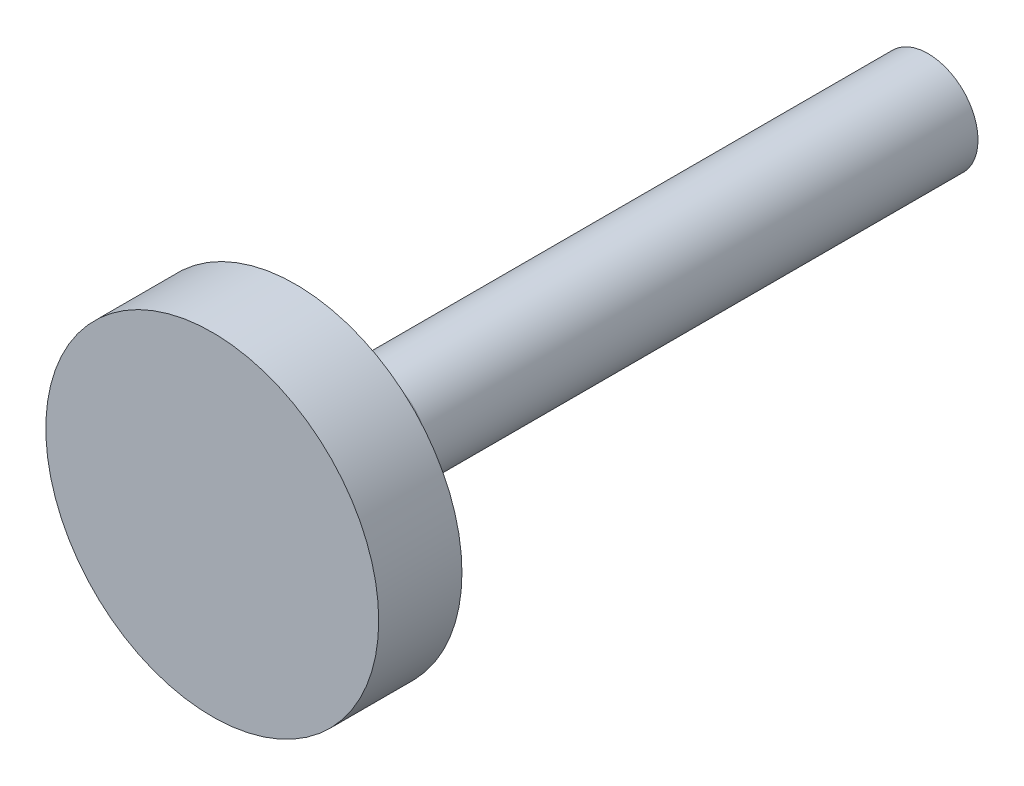
ISO-10303-21;
HEADER;
FILE_DESCRIPTION(('STEP AP214'),'2;1');
FILE_NAME('part.step','',(''),(''),'','','');
FILE_SCHEMA(('AUTOMOTIVE_DESIGN { 1 0 10303 214 1 1 1 1 }'));
ENDSEC;
DATA;
#1=APPLICATION_CONTEXT('core data for automotive mechanical design processes');
#2=APPLICATION_PROTOCOL_DEFINITION('international standard','automotive_design',2000,#1);
#3=PRODUCT_CONTEXT('',#1,'mechanical');
#4=PRODUCT('Part','Part','',(#3));
#5=PRODUCT_RELATED_PRODUCT_CATEGORY('part','',(#4));
#6=PRODUCT_DEFINITION_FORMATION('','',#4);
#7=PRODUCT_DEFINITION_CONTEXT('part definition',#1,'design');
#8=PRODUCT_DEFINITION('design','',#6,#7);
#9=PRODUCT_DEFINITION_SHAPE('','',#8);
#10=(LENGTH_UNIT() NAMED_UNIT(*) SI_UNIT(.MILLI.,.METRE.));
#11=(NAMED_UNIT(*) PLANE_ANGLE_UNIT() SI_UNIT($,.RADIAN.));
#12=(NAMED_UNIT(*) SI_UNIT($,.STERADIAN.) SOLID_ANGLE_UNIT());
#13=UNCERTAINTY_MEASURE_WITH_UNIT(LENGTH_MEASURE(1.E-05),#10,'distance_accuracy_value','');
#14=(GEOMETRIC_REPRESENTATION_CONTEXT(3) GLOBAL_UNCERTAINTY_ASSIGNED_CONTEXT((#13)) GLOBAL_UNIT_ASSIGNED_CONTEXT((#10,
#11,#12)) REPRESENTATION_CONTEXT('',''));
#15=CARTESIAN_POINT('',(0.,0.,0.));
#16=DIRECTION('',(0.,0.,1.));
#17=DIRECTION('',(1.,0.,0.));
#18=AXIS2_PLACEMENT_3D('',#15,#16,#17);
#19=CARTESIAN_POINT('',(0.,0.,38.));
#20=DIRECTION('',(0.,0.,-1.));
#21=DIRECTION('',(-1.,0.,0.));
#22=AXIS2_PLACEMENT_3D('',#19,#20,#21);
#23=CYLINDRICAL_SURFACE('',#22,3.);
#24=CARTESIAN_POINT('',(0.,0.,33.));
#25=DIRECTION('',(0.,0.,1.));
#26=DIRECTION('',(1.,0.,0.));
#27=AXIS2_PLACEMENT_3D('',#24,#25,#26);
#28=CIRCLE('',#27,3.);
#29=CARTESIAN_POINT('',(3.,0.,33.));
#30=VERTEX_POINT('',#29);
#31=EDGE_CURVE('E10',#30,#30,#28,.F.);
#32=ORIENTED_EDGE('',*,*,#31,.T.);
#33=EDGE_LOOP('',(#32));
#34=FACE_BOUND('',#33,.T.);
#35=CARTESIAN_POINT('',(0.,0.,0.));
#36=DIRECTION('',(0.,0.,1.));
#37=DIRECTION('',(1.,0.,0.));
#38=AXIS2_PLACEMENT_3D('',#35,#36,#37);
#39=CIRCLE('',#38,3.);
#40=CARTESIAN_POINT('',(3.,0.,0.));
#41=VERTEX_POINT('',#40);
#42=EDGE_CURVE('E50',#41,#41,#39,.T.);
#43=ORIENTED_EDGE('',*,*,#42,.T.);
#44=EDGE_LOOP('',(#43));
#45=FACE_BOUND('',#44,.T.);
#46=ADVANCED_FACE('F37',(#34,#45),#23,.T.);
#47=CARTESIAN_POINT('',(0.,0.,0.));
#48=DIRECTION('',(0.,0.,1.));
#49=DIRECTION('',(1.,0.,0.));
#50=AXIS2_PLACEMENT_3D('',#47,#48,#49);
#51=PLANE('',#50);
#52=ORIENTED_EDGE('',*,*,#42,.F.);
#53=EDGE_LOOP('',(#52));
#54=FACE_BOUND('',#53,.T.);
#55=ADVANCED_FACE('F71',(#54),#51,.F.);
#56=CARTESIAN_POINT('',(0.,0.,43.));
#57=DIRECTION('',(0.,0.,-1.));
#58=DIRECTION('',(-1.,0.,0.));
#59=AXIS2_PLACEMENT_3D('',#56,#57,#58);
#60=CYLINDRICAL_SURFACE('',#59,10.);
#61=CARTESIAN_POINT('',(0.,0.,43.));
#62=DIRECTION('',(0.,0.,1.));
#63=DIRECTION('',(1.,0.,0.));
#64=AXIS2_PLACEMENT_3D('',#61,#62,#63);
#65=CIRCLE('',#64,10.);
#66=CARTESIAN_POINT('',(10.,0.,43.));
#67=VERTEX_POINT('',#66);
#68=EDGE_CURVE('E55',#67,#67,#65,.T.);
#69=ORIENTED_EDGE('',*,*,#68,.F.);
#70=EDGE_LOOP('',(#69));
#71=FACE_BOUND('',#70,.T.);
#72=CARTESIAN_POINT('',(0.,0.,38.));
#73=DIRECTION('',(0.,0.,1.));
#74=DIRECTION('',(1.,0.,0.));
#75=AXIS2_PLACEMENT_3D('',#72,#73,#74);
#76=CIRCLE('',#75,10.);
#77=CARTESIAN_POINT('',(10.,0.,38.));
#78=VERTEX_POINT('',#77);
#79=EDGE_CURVE('E58',#78,#78,#76,.T.);
#80=ORIENTED_EDGE('',*,*,#79,.T.);
#81=EDGE_LOOP('',(#80));
#82=FACE_BOUND('',#81,.T.);
#83=ADVANCED_FACE('F68',(#71,#82),#60,.T.);
#84=CARTESIAN_POINT('',(0.,0.,43.));
#85=DIRECTION('',(0.,0.,1.));
#86=DIRECTION('',(1.,0.,0.));
#87=AXIS2_PLACEMENT_3D('',#84,#85,#86);
#88=PLANE('',#87);
#89=ORIENTED_EDGE('',*,*,#68,.T.);
#90=EDGE_LOOP('',(#89));
#91=FACE_BOUND('',#90,.T.);
#92=ADVANCED_FACE('F66',(#91),#88,.T.);
#93=CARTESIAN_POINT('',(0.,0.,38.));
#94=DIRECTION('',(0.,0.,1.));
#95=DIRECTION('',(1.,0.,0.));
#96=AXIS2_PLACEMENT_3D('',#93,#94,#95);
#97=PLANE('',#96);
#98=CARTESIAN_POINT('',(0.,0.,38.));
#99=DIRECTION('',(0.,0.,1.));
#100=DIRECTION('',(1.,0.,0.));
#101=AXIS2_PLACEMENT_3D('',#98,#99,#100);
#102=CIRCLE('',#101,8.);
#103=CARTESIAN_POINT('',(8.,0.,38.));
#104=VERTEX_POINT('',#103);
#105=EDGE_CURVE('E45',#104,#104,#102,.T.);
#106=ORIENTED_EDGE('',*,*,#105,.T.);
#107=EDGE_LOOP('',(#106));
#108=FACE_BOUND('',#107,.T.);
#109=ORIENTED_EDGE('',*,*,#79,.F.);
#110=EDGE_LOOP('',(#109));
#111=FACE_BOUND('',#110,.T.);
#112=ADVANCED_FACE('F75',(#108,#111),#97,.F.);
#113=CARTESIAN_POINT('',(0.,0.,33.));
#114=DIRECTION('',(0.,0.,1.));
#115=DIRECTION('',(1.,0.,0.));
#116=AXIS2_PLACEMENT_3D('',#113,#114,#115);
#117=TOROIDAL_SURFACE('',#116,8.,5.);
#118=ORIENTED_EDGE('',*,*,#31,.F.);
#119=EDGE_LOOP('',(#118));
#120=FACE_BOUND('',#119,.T.);
#121=ORIENTED_EDGE('',*,*,#105,.F.);
#122=EDGE_LOOP('',(#121));
#123=FACE_BOUND('',#122,.T.);
#124=ADVANCED_FACE('F39',(#120,#123),#117,.F.);
#125=CLOSED_SHELL('',(#46,#55,#83,#92,#112,#124));
#126=MANIFOLD_SOLID_BREP('B2',#125);
#127=ADVANCED_BREP_SHAPE_REPRESENTATION('',(#18,#126),#14);
#128=SHAPE_DEFINITION_REPRESENTATION(#9,#127);
ENDSEC;
END-ISO-10303-21;
